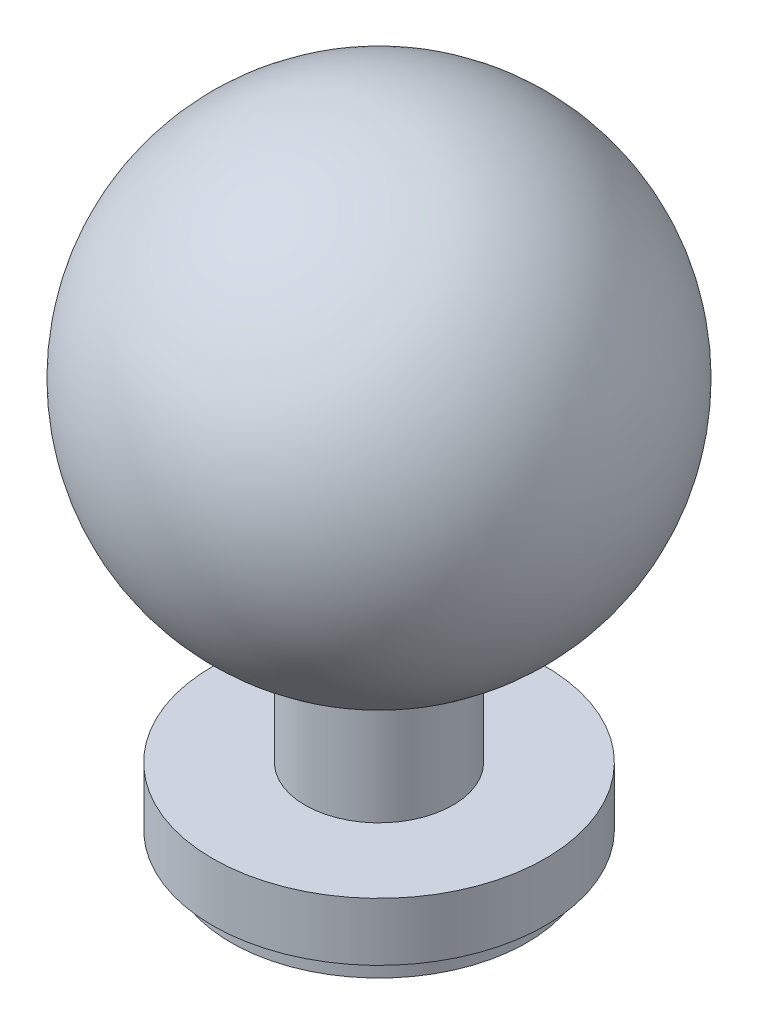
ISO-10303-21;
HEADER;
FILE_DESCRIPTION(('STEP AP214'),'2;1');
FILE_NAME('part.step','',(''),(''),'','','');
FILE_SCHEMA(('AUTOMOTIVE_DESIGN { 1 0 10303 214 1 1 1 1 }'));
ENDSEC;
DATA;
#1=APPLICATION_CONTEXT('core data for automotive mechanical design processes');
#2=APPLICATION_PROTOCOL_DEFINITION('international standard','automotive_design',2000,#1);
#3=PRODUCT_CONTEXT('',#1,'mechanical');
#4=PRODUCT('Part','Part','',(#3));
#5=PRODUCT_RELATED_PRODUCT_CATEGORY('part','',(#4));
#6=PRODUCT_DEFINITION_FORMATION('','',#4);
#7=PRODUCT_DEFINITION_CONTEXT('part definition',#1,'design');
#8=PRODUCT_DEFINITION('design','',#6,#7);
#9=PRODUCT_DEFINITION_SHAPE('','',#8);
#10=(LENGTH_UNIT() NAMED_UNIT(*) SI_UNIT(.MILLI.,.METRE.));
#11=(NAMED_UNIT(*) PLANE_ANGLE_UNIT() SI_UNIT($,.RADIAN.));
#12=(NAMED_UNIT(*) SI_UNIT($,.STERADIAN.) SOLID_ANGLE_UNIT());
#13=UNCERTAINTY_MEASURE_WITH_UNIT(LENGTH_MEASURE(1.E-05),#10,'distance_accuracy_value','');
#14=(GEOMETRIC_REPRESENTATION_CONTEXT(3) GLOBAL_UNCERTAINTY_ASSIGNED_CONTEXT((#13)) GLOBAL_UNIT_ASSIGNED_CONTEXT((#10,
#11,#12)) REPRESENTATION_CONTEXT('',''));
#15=CARTESIAN_POINT('',(0.,0.,0.));
#16=DIRECTION('',(0.,0.,1.));
#17=DIRECTION('',(1.,0.,0.));
#18=AXIS2_PLACEMENT_3D('',#15,#16,#17);
#19=CARTESIAN_POINT('',(0.,10.57,0.));
#20=DIRECTION('',(0.,-1.,0.));
#21=DIRECTION('',(0.,0.,-1.));
#22=AXIS2_PLACEMENT_3D('',#19,#20,#21);
#23=CYLINDRICAL_SURFACE('',#22,2.);
#24=CARTESIAN_POINT('',(0.,1.57,0.));
#25=DIRECTION('',(0.,1.,0.));
#26=DIRECTION('',(0.,0.,1.));
#27=AXIS2_PLACEMENT_3D('',#24,#25,#26);
#28=CIRCLE('',#27,2.);
#29=CARTESIAN_POINT('',(0.,1.57,2.));
#30=VERTEX_POINT('',#29);
#31=EDGE_CURVE('E42',#30,#30,#28,.T.);
#32=ORIENTED_EDGE('',*,*,#31,.T.);
#33=EDGE_LOOP('',(#32));
#34=FACE_BOUND('',#33,.T.);
#35=CARTESIAN_POINT('',(0.,4.54318492070646,0.));
#36=DIRECTION('',(0.,1.,0.));
#37=DIRECTION('',(0.,0.,1.));
#38=AXIS2_PLACEMENT_3D('',#35,#36,#37);
#39=CIRCLE('',#38,2.);
#40=CARTESIAN_POINT('',(0.,4.54318492070646,2.));
#41=VERTEX_POINT('',#40);
#42=EDGE_CURVE('E34',#41,#41,#39,.T.);
#43=ORIENTED_EDGE('',*,*,#42,.F.);
#44=EDGE_LOOP('',(#43));
#45=FACE_BOUND('',#44,.T.);
#46=ADVANCED_FACE('F30',(#34,#45),#23,.T.);
#47=CARTESIAN_POINT('',(0.,1.57,0.));
#48=DIRECTION('',(0.,-1.,0.));
#49=DIRECTION('',(0.,0.,-1.));
#50=AXIS2_PLACEMENT_3D('',#47,#48,#49);
#51=CYLINDRICAL_SURFACE('',#50,4.5);
#52=CARTESIAN_POINT('',(0.,1.57,0.));
#53=DIRECTION('',(0.,1.,0.));
#54=DIRECTION('',(0.,0.,1.));
#55=AXIS2_PLACEMENT_3D('',#52,#53,#54);
#56=CIRCLE('',#55,4.5);
#57=CARTESIAN_POINT('',(0.,1.57,4.5));
#58=VERTEX_POINT('',#57);
#59=EDGE_CURVE('E48',#58,#58,#56,.T.);
#60=ORIENTED_EDGE('',*,*,#59,.F.);
#61=EDGE_LOOP('',(#60));
#62=FACE_BOUND('',#61,.T.);
#63=CARTESIAN_POINT('',(0.,0.,0.));
#64=DIRECTION('',(0.,1.,0.));
#65=DIRECTION('',(0.,0.,1.));
#66=AXIS2_PLACEMENT_3D('',#63,#64,#65);
#67=CIRCLE('',#66,4.5);
#68=CARTESIAN_POINT('',(0.,0.,4.5));
#69=VERTEX_POINT('',#68);
#70=EDGE_CURVE('E50',#69,#69,#67,.T.);
#71=ORIENTED_EDGE('',*,*,#70,.T.);
#72=EDGE_LOOP('',(#71));
#73=FACE_BOUND('',#72,.T.);
#74=ADVANCED_FACE('F32',(#62,#73),#51,.T.);
#75=CARTESIAN_POINT('',(0.,1.57,0.));
#76=DIRECTION('',(0.,1.,0.));
#77=DIRECTION('',(0.,0.,1.));
#78=AXIS2_PLACEMENT_3D('',#75,#76,#77);
#79=PLANE('',#78);
#80=ORIENTED_EDGE('',*,*,#31,.F.);
#81=EDGE_LOOP('',(#80));
#82=FACE_BOUND('',#81,.T.);
#83=ORIENTED_EDGE('',*,*,#59,.T.);
#84=EDGE_LOOP('',(#83));
#85=FACE_BOUND('',#84,.T.);
#86=ADVANCED_FACE('F77',(#82,#85),#79,.T.);
#87=CARTESIAN_POINT('',(0.,0.,0.));
#88=DIRECTION('',(0.,1.,0.));
#89=DIRECTION('',(0.,0.,1.));
#90=AXIS2_PLACEMENT_3D('',#87,#88,#89);
#91=PLANE('',#90);
#92=CARTESIAN_POINT('',(0.,0.,0.));
#93=DIRECTION('',(0.,-1.,0.));
#94=DIRECTION('',(0.,0.,-1.));
#95=AXIS2_PLACEMENT_3D('',#92,#93,#94);
#96=CIRCLE('',#95,4.);
#97=CARTESIAN_POINT('',(0.,0.,-4.));
#98=VERTEX_POINT('',#97);
#99=EDGE_CURVE('E10',#98,#98,#96,.T.);
#100=ORIENTED_EDGE('',*,*,#99,.F.);
#101=EDGE_LOOP('',(#100));
#102=FACE_BOUND('',#101,.T.);
#103=ORIENTED_EDGE('',*,*,#70,.F.);
#104=EDGE_LOOP('',(#103));
#105=FACE_BOUND('',#104,.T.);
#106=ADVANCED_FACE('F68',(#102,#105),#91,.F.);
#107=CARTESIAN_POINT('',(0.,10.57,0.));
#108=DIRECTION('',(0.,0.,-1.));
#109=DIRECTION('',(1.,0.,0.));
#110=AXIS2_PLACEMENT_3D('',#107,#108,#109);
#111=SPHERICAL_SURFACE('',#110,6.35);
#112=CARTESIAN_POINT('',(0.,10.57,0.));
#113=DIRECTION('',(0.,1.,0.));
#114=DIRECTION('',(0.,0.,1.));
#115=AXIS2_PLACEMENT_3D('',#112,#113,#114);
#116=SPHERICAL_SURFACE('',#115,6.35);
#117=ORIENTED_EDGE('',*,*,#42,.T.);
#118=EDGE_LOOP('',(#117));
#119=FACE_BOUND('',#118,.T.);
#120=ADVANCED_FACE('F61',(#119),#116,.T.);
#121=CARTESIAN_POINT('',(0.,-0.65,0.));
#122=DIRECTION('',(0.,1.,0.));
#123=DIRECTION('',(0.,0.,1.));
#124=AXIS2_PLACEMENT_3D('',#121,#122,#123);
#125=CYLINDRICAL_SURFACE('',#124,4.);
#126=CARTESIAN_POINT('',(0.,-0.65,0.));
#127=DIRECTION('',(0.,-1.,0.));
#128=DIRECTION('',(0.,0.,-1.));
#129=AXIS2_PLACEMENT_3D('',#126,#127,#128);
#130=CIRCLE('',#129,4.);
#131=CARTESIAN_POINT('',(0.,-0.65,-4.));
#132=VERTEX_POINT('',#131);
#133=EDGE_CURVE('E45',#132,#132,#130,.T.);
#134=ORIENTED_EDGE('',*,*,#133,.F.);
#135=EDGE_LOOP('',(#134));
#136=FACE_BOUND('',#135,.T.);
#137=ORIENTED_EDGE('',*,*,#99,.T.);
#138=EDGE_LOOP('',(#137));
#139=FACE_BOUND('',#138,.T.);
#140=ADVANCED_FACE('F59',(#136,#139),#125,.T.);
#141=CARTESIAN_POINT('',(0.,-0.65,0.));
#142=DIRECTION('',(0.,-1.,0.));
#143=DIRECTION('',(0.,0.,-1.));
#144=AXIS2_PLACEMENT_3D('',#141,#142,#143);
#145=PLANE('',#144);
#146=ORIENTED_EDGE('',*,*,#133,.T.);
#147=EDGE_LOOP('',(#146));
#148=FACE_BOUND('',#147,.T.);
#149=ADVANCED_FACE('F57',(#148),#145,.T.);
#150=CLOSED_SHELL('',(#46,#74,#86,#106,#120,#140,#149));
#151=MANIFOLD_SOLID_BREP('B2',#150);
#152=ADVANCED_BREP_SHAPE_REPRESENTATION('',(#18,#151),#14);
#153=SHAPE_DEFINITION_REPRESENTATION(#9,#152);
ENDSEC;
END-ISO-10303-21;
